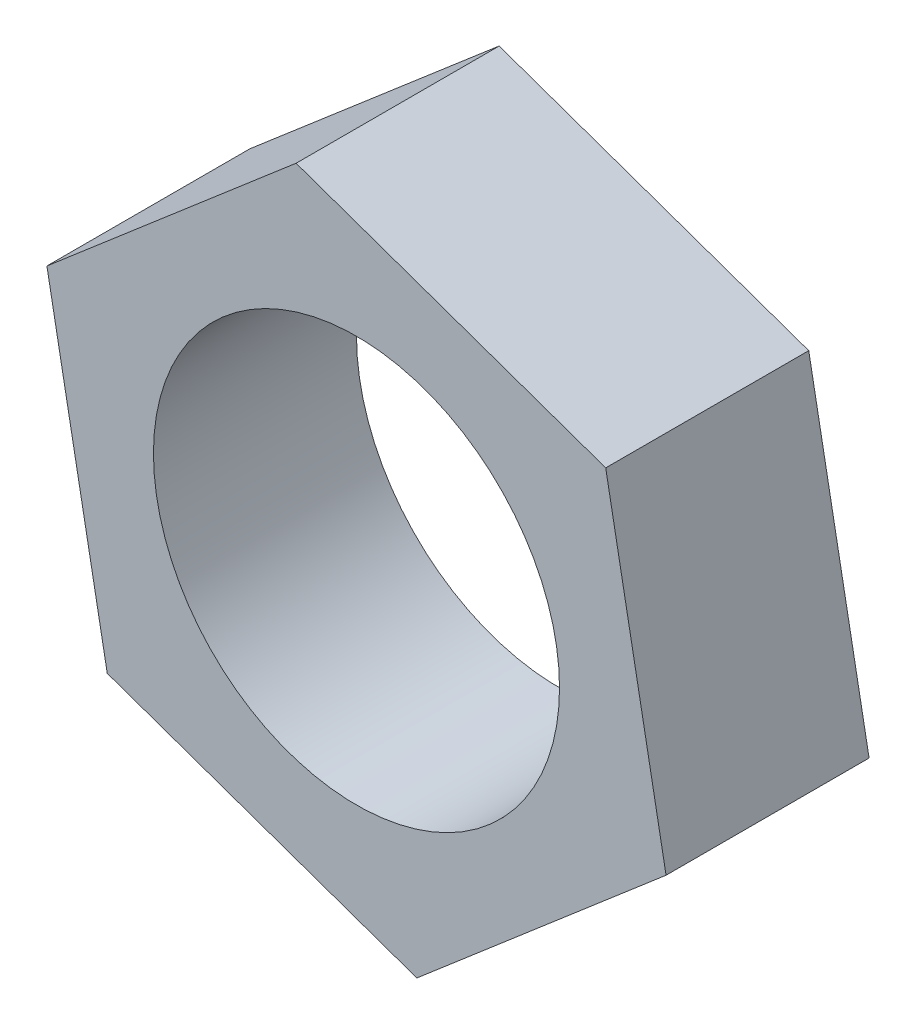
ISO-10303-21;
HEADER;
FILE_DESCRIPTION(('STEP AP214'),'2;1');
FILE_NAME('part.step','',(''),(''),'','','');
FILE_SCHEMA(('AUTOMOTIVE_DESIGN { 1 0 10303 214 1 1 1 1 }'));
ENDSEC;
DATA;
#1=APPLICATION_CONTEXT('core data for automotive mechanical design processes');
#2=APPLICATION_PROTOCOL_DEFINITION('international standard','automotive_design',2000,#1);
#3=PRODUCT_CONTEXT('',#1,'mechanical');
#4=PRODUCT('Part','Part','',(#3));
#5=PRODUCT_RELATED_PRODUCT_CATEGORY('part','',(#4));
#6=PRODUCT_DEFINITION_FORMATION('','',#4);
#7=PRODUCT_DEFINITION_CONTEXT('part definition',#1,'design');
#8=PRODUCT_DEFINITION('design','',#6,#7);
#9=PRODUCT_DEFINITION_SHAPE('','',#8);
#10=(LENGTH_UNIT() NAMED_UNIT(*) SI_UNIT(.MILLI.,.METRE.));
#11=(NAMED_UNIT(*) PLANE_ANGLE_UNIT() SI_UNIT($,.RADIAN.));
#12=(NAMED_UNIT(*) SI_UNIT($,.STERADIAN.) SOLID_ANGLE_UNIT());
#13=UNCERTAINTY_MEASURE_WITH_UNIT(LENGTH_MEASURE(1.E-05),#10,'distance_accuracy_value','');
#14=(GEOMETRIC_REPRESENTATION_CONTEXT(3) GLOBAL_UNCERTAINTY_ASSIGNED_CONTEXT((#13)) GLOBAL_UNIT_ASSIGNED_CONTEXT((#10,
#11,#12)) REPRESENTATION_CONTEXT('',''));
#15=CARTESIAN_POINT('',(0.,0.,0.));
#16=DIRECTION('',(0.,0.,1.));
#17=DIRECTION('',(1.,0.,0.));
#18=AXIS2_PLACEMENT_3D('',#15,#16,#17);
#19=CARTESIAN_POINT('',(0.,0.,2.5));
#20=DIRECTION('',(0.,0.,1.));
#21=DIRECTION('',(1.,0.,0.));
#22=AXIS2_PLACEMENT_3D('',#19,#20,#21);
#23=PLANE('',#22);
#24=DIRECTION('',(0.943204218219432,-0.332213489691598,0.));
#25=VECTOR('',#24,1.);
#26=CARTESIAN_POINT('',(-6.13740889286964,-5.25980469362295,2.5));
#27=LINE('',#26,#25);
#28=CARTESIAN_POINT('',(-6.13740889286964,-5.25980469362295,2.5));
#29=VERTEX_POINT('',#28);
#30=CARTESIAN_POINT('',(1.48642003718727,-7.94505436144911,2.5));
#31=VERTEX_POINT('',#30);
#32=EDGE_CURVE('E146',#29,#31,#27,.T.);
#33=ORIENTED_EDGE('',*,*,#32,.T.);
#34=DIRECTION('',(0.75930743066252,0.650732069088871,0.));
#35=VECTOR('',#34,1.);
#36=CARTESIAN_POINT('',(1.48642003718727,-7.94505436144911,2.5));
#37=LINE('',#36,#35);
#38=CARTESIAN_POINT('',(7.62382893005692,-2.68524966782617,2.5));
#39=VERTEX_POINT('',#38);
#40=EDGE_CURVE('E94',#31,#39,#37,.T.);
#41=ORIENTED_EDGE('',*,*,#40,.T.);
#42=DIRECTION('',(-0.183896787556913,0.982945558780469,0.));
#43=VECTOR('',#42,1.);
#44=CARTESIAN_POINT('',(7.62382893005692,-2.68524966782617,2.5));
#45=LINE('',#44,#43);
#46=CARTESIAN_POINT('',(6.13740889286964,5.25980469362295,2.5));
#47=VERTEX_POINT('',#46);
#48=EDGE_CURVE('E107',#39,#47,#45,.T.);
#49=ORIENTED_EDGE('',*,*,#48,.T.);
#50=DIRECTION('',(-0.943204218219432,0.332213489691598,0.));
#51=VECTOR('',#50,1.);
#52=CARTESIAN_POINT('',(6.13740889286964,5.25980469362295,2.5));
#53=LINE('',#52,#51);
#54=CARTESIAN_POINT('',(-1.48642003718727,7.94505436144911,2.5));
#55=VERTEX_POINT('',#54);
#56=EDGE_CURVE('E101',#47,#55,#53,.T.);
#57=ORIENTED_EDGE('',*,*,#56,.T.);
#58=DIRECTION('',(-0.75930743066252,-0.650732069088871,0.));
#59=VECTOR('',#58,1.);
#60=CARTESIAN_POINT('',(-1.48642003718727,7.94505436144911,2.5));
#61=LINE('',#60,#59);
#62=CARTESIAN_POINT('',(-7.62382893005692,2.68524966782617,2.5));
#63=VERTEX_POINT('',#62);
#64=EDGE_CURVE('E105',#55,#63,#61,.T.);
#65=ORIENTED_EDGE('',*,*,#64,.T.);
#66=DIRECTION('',(0.183896787556913,-0.982945558780469,0.));
#67=VECTOR('',#66,1.);
#68=CARTESIAN_POINT('',(-7.62382893005692,2.68524966782617,2.5));
#69=LINE('',#68,#67);
#70=EDGE_CURVE('E57',#63,#29,#69,.T.);
#71=ORIENTED_EDGE('',*,*,#70,.T.);
#72=EDGE_LOOP('',(#33,#41,#49,#57,#65,#71));
#73=FACE_BOUND('',#72,.T.);
#74=CARTESIAN_POINT('',(0.,0.,2.5));
#75=DIRECTION('',(0.,0.,1.));
#76=DIRECTION('',(1.,0.,0.));
#77=AXIS2_PLACEMENT_3D('',#74,#75,#76);
#78=CIRCLE('',#77,5.);
#79=CARTESIAN_POINT('',(5.,0.,2.5));
#80=VERTEX_POINT('',#79);
#81=EDGE_CURVE('E134',#80,#80,#78,.T.);
#82=ORIENTED_EDGE('',*,*,#81,.F.);
#83=EDGE_LOOP('',(#82));
#84=FACE_BOUND('',#83,.T.);
#85=ADVANCED_FACE('F39',(#73,#84),#23,.T.);
#86=CARTESIAN_POINT('',(0.,0.,-2.5));
#87=DIRECTION('',(0.,0.,1.));
#88=DIRECTION('',(1.,0.,0.));
#89=AXIS2_PLACEMENT_3D('',#86,#87,#88);
#90=PLANE('',#89);
#91=DIRECTION('',(0.943204218219432,-0.332213489691598,0.));
#92=VECTOR('',#91,1.);
#93=CARTESIAN_POINT('',(-6.13740889286964,-5.25980469362295,-2.5));
#94=LINE('',#93,#92);
#95=CARTESIAN_POINT('',(-6.13740889286964,-5.25980469362295,-2.5));
#96=VERTEX_POINT('',#95);
#97=CARTESIAN_POINT('',(1.48642003718727,-7.94505436144911,-2.5));
#98=VERTEX_POINT('',#97);
#99=EDGE_CURVE('E129',#96,#98,#94,.T.);
#100=ORIENTED_EDGE('',*,*,#99,.F.);
#101=DIRECTION('',(0.183896787556913,-0.982945558780469,0.));
#102=VECTOR('',#101,1.);
#103=CARTESIAN_POINT('',(-7.62382893005692,2.68524966782617,-2.5));
#104=LINE('',#103,#102);
#105=CARTESIAN_POINT('',(-7.62382893005692,2.68524966782617,-2.5));
#106=VERTEX_POINT('',#105);
#107=EDGE_CURVE('E86',#106,#96,#104,.T.);
#108=ORIENTED_EDGE('',*,*,#107,.F.);
#109=DIRECTION('',(-0.75930743066252,-0.650732069088871,0.));
#110=VECTOR('',#109,1.);
#111=CARTESIAN_POINT('',(-1.48642003718727,7.94505436144911,-2.5));
#112=LINE('',#111,#110);
#113=CARTESIAN_POINT('',(-1.48642003718727,7.94505436144911,-2.5));
#114=VERTEX_POINT('',#113);
#115=EDGE_CURVE('E80',#114,#106,#112,.T.);
#116=ORIENTED_EDGE('',*,*,#115,.F.);
#117=DIRECTION('',(-0.943204218219432,0.332213489691598,0.));
#118=VECTOR('',#117,1.);
#119=CARTESIAN_POINT('',(6.13740889286964,5.25980469362295,-2.5));
#120=LINE('',#119,#118);
#121=CARTESIAN_POINT('',(6.13740889286964,5.25980469362295,-2.5));
#122=VERTEX_POINT('',#121);
#123=EDGE_CURVE('E116',#122,#114,#120,.T.);
#124=ORIENTED_EDGE('',*,*,#123,.F.);
#125=DIRECTION('',(-0.183896787556913,0.982945558780469,0.));
#126=VECTOR('',#125,1.);
#127=CARTESIAN_POINT('',(7.62382893005692,-2.68524966782617,-2.5));
#128=LINE('',#127,#126);
#129=CARTESIAN_POINT('',(7.62382893005692,-2.68524966782617,-2.5));
#130=VERTEX_POINT('',#129);
#131=EDGE_CURVE('E137',#130,#122,#128,.T.);
#132=ORIENTED_EDGE('',*,*,#131,.F.);
#133=DIRECTION('',(0.75930743066252,0.650732069088871,0.));
#134=VECTOR('',#133,1.);
#135=CARTESIAN_POINT('',(1.48642003718727,-7.94505436144911,-2.5));
#136=LINE('',#135,#134);
#137=EDGE_CURVE('E133',#98,#130,#136,.T.);
#138=ORIENTED_EDGE('',*,*,#137,.F.);
#139=EDGE_LOOP('',(#100,#108,#116,#124,#132,#138));
#140=FACE_BOUND('',#139,.T.);
#141=CARTESIAN_POINT('',(0.,0.,-2.5));
#142=DIRECTION('',(0.,0.,1.));
#143=DIRECTION('',(1.,0.,0.));
#144=AXIS2_PLACEMENT_3D('',#141,#142,#143);
#145=CIRCLE('',#144,5.);
#146=CARTESIAN_POINT('',(5.,0.,-2.5));
#147=VERTEX_POINT('',#146);
#148=EDGE_CURVE('E243',#147,#147,#145,.T.);
#149=ORIENTED_EDGE('',*,*,#148,.T.);
#150=EDGE_LOOP('',(#149));
#151=FACE_BOUND('',#150,.T.);
#152=ADVANCED_FACE('F159',(#140,#151),#90,.F.);
#153=CARTESIAN_POINT('',(-6.13740889286964,-5.25980469362295,2.5));
#154=DIRECTION('',(0.332213489691598,0.943204218219432,0.));
#155=DIRECTION('',(-0.943204218219432,0.332213489691598,0.));
#156=AXIS2_PLACEMENT_3D('',#153,#154,#155);
#157=PLANE('',#156);
#158=ORIENTED_EDGE('',*,*,#99,.T.);
#159=DIRECTION('',(0.,0.,-1.));
#160=VECTOR('',#159,1.);
#161=CARTESIAN_POINT('',(1.48642003718727,-7.94505436144911,2.5));
#162=LINE('',#161,#160);
#163=EDGE_CURVE('E11',#31,#98,#162,.T.);
#164=ORIENTED_EDGE('',*,*,#163,.F.);
#165=ORIENTED_EDGE('',*,*,#32,.F.);
#166=DIRECTION('',(0.,0.,-1.));
#167=VECTOR('',#166,1.);
#168=CARTESIAN_POINT('',(-6.13740889286964,-5.25980469362295,2.5));
#169=LINE('',#168,#167);
#170=EDGE_CURVE('E125',#29,#96,#169,.T.);
#171=ORIENTED_EDGE('',*,*,#170,.T.);
#172=EDGE_LOOP('',(#158,#164,#165,#171));
#173=FACE_BOUND('',#172,.T.);
#174=ADVANCED_FACE('F41',(#173),#157,.F.);
#175=CARTESIAN_POINT('',(1.48642003718727,-7.94505436144911,2.5));
#176=DIRECTION('',(-0.650732069088871,0.75930743066252,0.));
#177=DIRECTION('',(-0.75930743066252,-0.650732069088871,0.));
#178=AXIS2_PLACEMENT_3D('',#175,#176,#177);
#179=PLANE('',#178);
#180=ORIENTED_EDGE('',*,*,#137,.T.);
#181=DIRECTION('',(0.,0.,-1.));
#182=VECTOR('',#181,1.);
#183=CARTESIAN_POINT('',(7.62382893005692,-2.68524966782617,2.5));
#184=LINE('',#183,#182);
#185=EDGE_CURVE('E49',#39,#130,#184,.T.);
#186=ORIENTED_EDGE('',*,*,#185,.F.);
#187=ORIENTED_EDGE('',*,*,#40,.F.);
#188=ORIENTED_EDGE('',*,*,#163,.T.);
#189=EDGE_LOOP('',(#180,#186,#187,#188));
#190=FACE_BOUND('',#189,.T.);
#191=ADVANCED_FACE('F184',(#190),#179,.F.);
#192=CARTESIAN_POINT('',(7.62382893005692,-2.68524966782617,2.5));
#193=DIRECTION('',(-0.982945558780469,-0.183896787556913,0.));
#194=DIRECTION('',(0.183896787556913,-0.982945558780469,0.));
#195=AXIS2_PLACEMENT_3D('',#192,#193,#194);
#196=PLANE('',#195);
#197=ORIENTED_EDGE('',*,*,#131,.T.);
#198=DIRECTION('',(0.,0.,-1.));
#199=VECTOR('',#198,1.);
#200=CARTESIAN_POINT('',(6.13740889286964,5.25980469362295,2.5));
#201=LINE('',#200,#199);
#202=EDGE_CURVE('E118',#47,#122,#201,.T.);
#203=ORIENTED_EDGE('',*,*,#202,.F.);
#204=ORIENTED_EDGE('',*,*,#48,.F.);
#205=ORIENTED_EDGE('',*,*,#185,.T.);
#206=EDGE_LOOP('',(#197,#203,#204,#205));
#207=FACE_BOUND('',#206,.T.);
#208=ADVANCED_FACE('F156',(#207),#196,.F.);
#209=CARTESIAN_POINT('',(6.13740889286964,5.25980469362295,2.5));
#210=DIRECTION('',(-0.332213489691598,-0.943204218219432,0.));
#211=DIRECTION('',(0.943204218219432,-0.332213489691598,0.));
#212=AXIS2_PLACEMENT_3D('',#209,#210,#211);
#213=PLANE('',#212);
#214=ORIENTED_EDGE('',*,*,#123,.T.);
#215=DIRECTION('',(0.,0.,-1.));
#216=VECTOR('',#215,1.);
#217=CARTESIAN_POINT('',(-1.48642003718727,7.94505436144911,2.5));
#218=LINE('',#217,#216);
#219=EDGE_CURVE('E113',#55,#114,#218,.T.);
#220=ORIENTED_EDGE('',*,*,#219,.F.);
#221=ORIENTED_EDGE('',*,*,#56,.F.);
#222=ORIENTED_EDGE('',*,*,#202,.T.);
#223=EDGE_LOOP('',(#214,#220,#221,#222));
#224=FACE_BOUND('',#223,.T.);
#225=ADVANCED_FACE('F114',(#224),#213,.F.);
#226=CARTESIAN_POINT('',(-1.48642003718727,7.94505436144911,2.5));
#227=DIRECTION('',(0.650732069088871,-0.75930743066252,0.));
#228=DIRECTION('',(0.75930743066252,0.650732069088871,0.));
#229=AXIS2_PLACEMENT_3D('',#226,#227,#228);
#230=PLANE('',#229);
#231=ORIENTED_EDGE('',*,*,#115,.T.);
#232=DIRECTION('',(0.,0.,-1.));
#233=VECTOR('',#232,1.);
#234=CARTESIAN_POINT('',(-7.62382893005692,2.68524966782617,2.5));
#235=LINE('',#234,#233);
#236=EDGE_CURVE('E119',#63,#106,#235,.T.);
#237=ORIENTED_EDGE('',*,*,#236,.F.);
#238=ORIENTED_EDGE('',*,*,#64,.F.);
#239=ORIENTED_EDGE('',*,*,#219,.T.);
#240=EDGE_LOOP('',(#231,#237,#238,#239));
#241=FACE_BOUND('',#240,.T.);
#242=ADVANCED_FACE('F121',(#241),#230,.F.);
#243=CARTESIAN_POINT('',(-7.62382893005692,2.68524966782617,2.5));
#244=DIRECTION('',(0.982945558780469,0.183896787556913,0.));
#245=DIRECTION('',(-0.183896787556913,0.982945558780469,0.));
#246=AXIS2_PLACEMENT_3D('',#243,#244,#245);
#247=PLANE('',#246);
#248=ORIENTED_EDGE('',*,*,#107,.T.);
#249=ORIENTED_EDGE('',*,*,#170,.F.);
#250=ORIENTED_EDGE('',*,*,#70,.F.);
#251=ORIENTED_EDGE('',*,*,#236,.T.);
#252=EDGE_LOOP('',(#248,#249,#250,#251));
#253=FACE_BOUND('',#252,.T.);
#254=ADVANCED_FACE('F164',(#253),#247,.F.);
#255=CARTESIAN_POINT('',(0.,0.,2.5));
#256=DIRECTION('',(0.,0.,-1.));
#257=DIRECTION('',(-1.,0.,0.));
#258=AXIS2_PLACEMENT_3D('',#255,#256,#257);
#259=CYLINDRICAL_SURFACE('',#258,5.);
#260=ORIENTED_EDGE('',*,*,#81,.T.);
#261=EDGE_LOOP('',(#260));
#262=FACE_BOUND('',#261,.T.);
#263=ORIENTED_EDGE('',*,*,#148,.F.);
#264=EDGE_LOOP('',(#263));
#265=FACE_BOUND('',#264,.T.);
#266=ADVANCED_FACE('F166',(#262,#265),#259,.F.);
#267=CLOSED_SHELL('',(#85,#152,#174,#191,#208,#225,#242,#254,#266));
#268=MANIFOLD_SOLID_BREP('B2',#267);
#269=ADVANCED_BREP_SHAPE_REPRESENTATION('',(#18,#268),#14);
#270=SHAPE_DEFINITION_REPRESENTATION(#9,#269);
ENDSEC;
END-ISO-10303-21;
